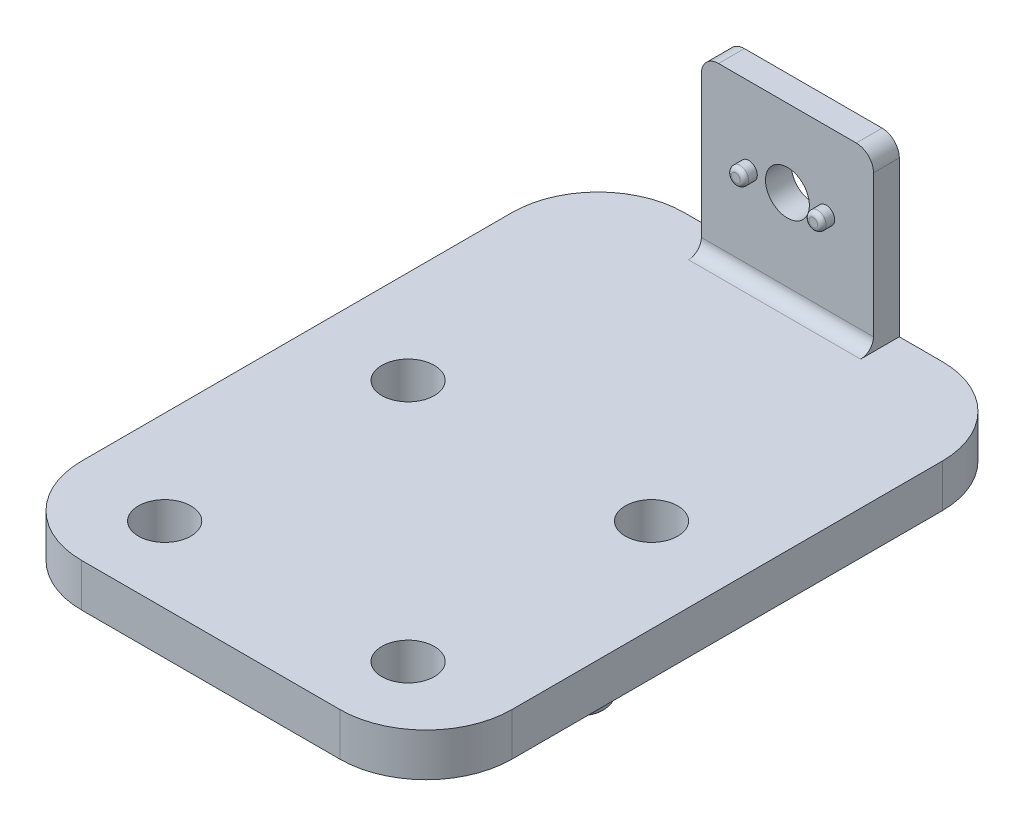
ISO-10303-21;
HEADER;
FILE_DESCRIPTION(('STEP AP214'),'2;1');
FILE_NAME('part.step','',(''),(''),'','','');
FILE_SCHEMA(('AUTOMOTIVE_DESIGN { 1 0 10303 214 1 1 1 1 }'));
ENDSEC;
DATA;
#1=APPLICATION_CONTEXT('core data for automotive mechanical design processes');
#2=APPLICATION_PROTOCOL_DEFINITION('international standard','automotive_design',2000,#1);
#3=PRODUCT_CONTEXT('',#1,'mechanical');
#4=PRODUCT('Part','Part','',(#3));
#5=PRODUCT_RELATED_PRODUCT_CATEGORY('part','',(#4));
#6=PRODUCT_DEFINITION_FORMATION('','',#4);
#7=PRODUCT_DEFINITION_CONTEXT('part definition',#1,'design');
#8=PRODUCT_DEFINITION('design','',#6,#7);
#9=PRODUCT_DEFINITION_SHAPE('','',#8);
#10=(LENGTH_UNIT() NAMED_UNIT(*) SI_UNIT(.MILLI.,.METRE.));
#11=(NAMED_UNIT(*) PLANE_ANGLE_UNIT() SI_UNIT($,.RADIAN.));
#12=(NAMED_UNIT(*) SI_UNIT($,.STERADIAN.) SOLID_ANGLE_UNIT());
#13=UNCERTAINTY_MEASURE_WITH_UNIT(LENGTH_MEASURE(1.E-05),#10,'distance_accuracy_value','');
#14=(GEOMETRIC_REPRESENTATION_CONTEXT(3) GLOBAL_UNCERTAINTY_ASSIGNED_CONTEXT((#13)) GLOBAL_UNIT_ASSIGNED_CONTEXT((#10,
#11,#12)) REPRESENTATION_CONTEXT('',''));
#15=CARTESIAN_POINT('',(0.,0.,0.));
#16=DIRECTION('',(0.,0.,1.));
#17=DIRECTION('',(1.,0.,0.));
#18=AXIS2_PLACEMENT_3D('',#15,#16,#17);
#19=CARTESIAN_POINT('',(-25.,5.,-47.0721884585665));
#20=DIRECTION('',(1.,0.,0.));
#21=DIRECTION('',(0.,0.,-1.));
#22=AXIS2_PLACEMENT_3D('',#19,#20,#21);
#23=PLANE('',#22);
#24=DIRECTION('',(0.,0.,1.));
#25=VECTOR('',#24,1.);
#26=CARTESIAN_POINT('',(-25.,5.,-47.0721884585665));
#27=LINE('',#26,#25);
#28=CARTESIAN_POINT('',(-25.,5.,-37.0721884585665));
#29=VERTEX_POINT('',#28);
#30=CARTESIAN_POINT('',(-25.,5.,12.9278115414336));
#31=VERTEX_POINT('',#30);
#32=EDGE_CURVE('E221',#29,#31,#27,.T.);
#33=ORIENTED_EDGE('',*,*,#32,.F.);
#34=DIRECTION('',(0.,-1.,0.));
#35=VECTOR('',#34,1.);
#36=CARTESIAN_POINT('',(-25.,5.,-37.0721884585665));
#37=LINE('',#36,#35);
#38=CARTESIAN_POINT('',(-25.,0.,-37.0721884585665));
#39=VERTEX_POINT('',#38);
#40=EDGE_CURVE('E265',#29,#39,#37,.T.);
#41=ORIENTED_EDGE('',*,*,#40,.T.);
#42=DIRECTION('',(0.,0.,1.));
#43=VECTOR('',#42,1.);
#44=CARTESIAN_POINT('',(-25.,0.,-47.0721884585665));
#45=LINE('',#44,#43);
#46=CARTESIAN_POINT('',(-25.,0.,12.9278115414336));
#47=VERTEX_POINT('',#46);
#48=EDGE_CURVE('E218',#39,#47,#45,.T.);
#49=ORIENTED_EDGE('',*,*,#48,.T.);
#50=DIRECTION('',(0.,-1.,0.));
#51=VECTOR('',#50,1.);
#52=CARTESIAN_POINT('',(-25.,5.,12.9278115414336));
#53=LINE('',#52,#51);
#54=EDGE_CURVE('E263',#47,#31,#53,.F.);
#55=ORIENTED_EDGE('',*,*,#54,.T.);
#56=EDGE_LOOP('',(#33,#41,#49,#55));
#57=FACE_BOUND('',#56,.T.);
#58=ADVANCED_FACE('F44',(#57),#23,.F.);
#59=CARTESIAN_POINT('',(-25.,5.,22.9278115414335));
#60=DIRECTION('',(0.,0.,-1.));
#61=DIRECTION('',(-1.,0.,0.));
#62=AXIS2_PLACEMENT_3D('',#59,#60,#61);
#63=PLANE('',#62);
#64=DIRECTION('',(1.,0.,0.));
#65=VECTOR('',#64,1.);
#66=CARTESIAN_POINT('',(-25.,5.,22.9278115414335));
#67=LINE('',#66,#65);
#68=CARTESIAN_POINT('',(-15.,5.,22.9278115414335));
#69=VERTEX_POINT('',#68);
#70=CARTESIAN_POINT('',(15.,5.,22.9278115414336));
#71=VERTEX_POINT('',#70);
#72=EDGE_CURVE('E224',#69,#71,#67,.T.);
#73=ORIENTED_EDGE('',*,*,#72,.F.);
#74=DIRECTION('',(0.,-1.,0.));
#75=VECTOR('',#74,1.);
#76=CARTESIAN_POINT('',(-15.,5.,22.9278115414335));
#77=LINE('',#76,#75);
#78=CARTESIAN_POINT('',(-15.,0.,22.9278115414335));
#79=VERTEX_POINT('',#78);
#80=EDGE_CURVE('E297',#69,#79,#77,.T.);
#81=ORIENTED_EDGE('',*,*,#80,.T.);
#82=DIRECTION('',(1.,0.,0.));
#83=VECTOR('',#82,1.);
#84=CARTESIAN_POINT('',(-25.,0.,22.9278115414335));
#85=LINE('',#84,#83);
#86=CARTESIAN_POINT('',(15.,0.,22.9278115414336));
#87=VERTEX_POINT('',#86);
#88=EDGE_CURVE('E238',#79,#87,#85,.T.);
#89=ORIENTED_EDGE('',*,*,#88,.T.);
#90=DIRECTION('',(0.,-1.,0.));
#91=VECTOR('',#90,1.);
#92=CARTESIAN_POINT('',(15.,5.,22.9278115414336));
#93=LINE('',#92,#91);
#94=EDGE_CURVE('E295',#87,#71,#93,.F.);
#95=ORIENTED_EDGE('',*,*,#94,.T.);
#96=EDGE_LOOP('',(#73,#81,#89,#95));
#97=FACE_BOUND('',#96,.T.);
#98=ADVANCED_FACE('F341',(#97),#63,.F.);
#99=CARTESIAN_POINT('',(25.,5.,-47.0721884585665));
#100=DIRECTION('',(-1.,0.,0.));
#101=DIRECTION('',(0.,0.,1.));
#102=AXIS2_PLACEMENT_3D('',#99,#100,#101);
#103=PLANE('',#102);
#104=DIRECTION('',(0.,0.,-1.));
#105=VECTOR('',#104,1.);
#106=CARTESIAN_POINT('',(25.,0.,-47.0721884585665));
#107=LINE('',#106,#105);
#108=CARTESIAN_POINT('',(25.,0.,12.9278115414335));
#109=VERTEX_POINT('',#108);
#110=CARTESIAN_POINT('',(25.,0.,-37.0721884585665));
#111=VERTEX_POINT('',#110);
#112=EDGE_CURVE('E241',#109,#111,#107,.T.);
#113=ORIENTED_EDGE('',*,*,#112,.T.);
#114=DIRECTION('',(0.,-1.,0.));
#115=VECTOR('',#114,1.);
#116=CARTESIAN_POINT('',(25.,5.,-37.0721884585665));
#117=LINE('',#116,#115);
#118=CARTESIAN_POINT('',(25.,5.,-37.0721884585665));
#119=VERTEX_POINT('',#118);
#120=EDGE_CURVE('E293',#111,#119,#117,.F.);
#121=ORIENTED_EDGE('',*,*,#120,.T.);
#122=DIRECTION('',(0.,0.,-1.));
#123=VECTOR('',#122,1.);
#124=CARTESIAN_POINT('',(25.,5.,-47.0721884585665));
#125=LINE('',#124,#123);
#126=CARTESIAN_POINT('',(25.,5.,12.9278115414335));
#127=VERTEX_POINT('',#126);
#128=EDGE_CURVE('E228',#127,#119,#125,.T.);
#129=ORIENTED_EDGE('',*,*,#128,.F.);
#130=DIRECTION('',(0.,-1.,0.));
#131=VECTOR('',#130,1.);
#132=CARTESIAN_POINT('',(25.,5.,12.9278115414335));
#133=LINE('',#132,#131);
#134=EDGE_CURVE('E290',#127,#109,#133,.T.);
#135=ORIENTED_EDGE('',*,*,#134,.T.);
#136=EDGE_LOOP('',(#113,#121,#129,#135));
#137=FACE_BOUND('',#136,.T.);
#138=ADVANCED_FACE('F347',(#137),#103,.F.);
#139=CARTESIAN_POINT('',(-25.,5.,-47.0721884585665));
#140=DIRECTION('',(0.,0.,1.));
#141=DIRECTION('',(1.,0.,0.));
#142=AXIS2_PLACEMENT_3D('',#139,#140,#141);
#143=PLANE('',#142);
#144=CARTESIAN_POINT('',(0.,16.,-47.0721884585665));
#145=DIRECTION('',(0.,0.,1.));
#146=DIRECTION('',(1.,0.,0.));
#147=AXIS2_PLACEMENT_3D('',#144,#145,#146);
#148=CIRCLE('',#147,2.55);
#149=CARTESIAN_POINT('',(2.55,16.,-47.0721884585665));
#150=VERTEX_POINT('',#149);
#151=EDGE_CURVE('E399',#150,#150,#148,.T.);
#152=ORIENTED_EDGE('',*,*,#151,.T.);
#153=EDGE_LOOP('',(#152));
#154=FACE_BOUND('',#153,.T.);
#155=DIRECTION('',(0.,-1.,0.));
#156=VECTOR('',#155,1.);
#157=CARTESIAN_POINT('',(-10.,25.,-47.0721884585665));
#158=LINE('',#157,#156);
#159=CARTESIAN_POINT('',(-10.,23.,-47.0721884585665));
#160=VERTEX_POINT('',#159);
#161=CARTESIAN_POINT('',(-10.,5.,-47.0721884585665));
#162=VERTEX_POINT('',#161);
#163=EDGE_CURVE('E190',#160,#162,#158,.T.);
#164=ORIENTED_EDGE('',*,*,#163,.F.);
#165=CARTESIAN_POINT('',(-8.,23.,-47.0721884585665));
#166=DIRECTION('',(0.,0.,1.));
#167=DIRECTION('',(1.,0.,0.));
#168=AXIS2_PLACEMENT_3D('',#165,#166,#167);
#169=CIRCLE('',#168,2.);
#170=CARTESIAN_POINT('',(-8.,25.,-47.0721884585665));
#171=VERTEX_POINT('',#170);
#172=EDGE_CURVE('E312',#160,#171,#169,.F.);
#173=ORIENTED_EDGE('',*,*,#172,.T.);
#174=DIRECTION('',(-1.,0.,0.));
#175=VECTOR('',#174,1.);
#176=CARTESIAN_POINT('',(-10.,25.,-47.0721884585665));
#177=LINE('',#176,#175);
#178=CARTESIAN_POINT('',(8.,25.,-47.0721884585665));
#179=VERTEX_POINT('',#178);
#180=EDGE_CURVE('E186',#179,#171,#177,.T.);
#181=ORIENTED_EDGE('',*,*,#180,.F.);
#182=CARTESIAN_POINT('',(8.,23.,-47.0721884585665));
#183=DIRECTION('',(0.,0.,1.));
#184=DIRECTION('',(1.,0.,0.));
#185=AXIS2_PLACEMENT_3D('',#182,#183,#184);
#186=CIRCLE('',#185,2.);
#187=CARTESIAN_POINT('',(10.,23.,-47.0721884585665));
#188=VERTEX_POINT('',#187);
#189=EDGE_CURVE('E59',#179,#188,#186,.F.);
#190=ORIENTED_EDGE('',*,*,#189,.T.);
#191=DIRECTION('',(0.,-1.,0.));
#192=VECTOR('',#191,1.);
#193=CARTESIAN_POINT('',(10.,25.,-47.0721884585665));
#194=LINE('',#193,#192);
#195=CARTESIAN_POINT('',(10.,5.,-47.0721884585665));
#196=VERTEX_POINT('',#195);
#197=EDGE_CURVE('E163',#188,#196,#194,.T.);
#198=ORIENTED_EDGE('',*,*,#197,.T.);
#199=DIRECTION('',(-1.,0.,0.));
#200=VECTOR('',#199,1.);
#201=CARTESIAN_POINT('',(-25.,5.,-47.0721884585665));
#202=LINE('',#201,#200);
#203=CARTESIAN_POINT('',(15.,5.,-47.0721884585665));
#204=VERTEX_POINT('',#203);
#205=EDGE_CURVE('E232',#204,#196,#202,.T.);
#206=ORIENTED_EDGE('',*,*,#205,.F.);
#207=DIRECTION('',(0.,-1.,0.));
#208=VECTOR('',#207,1.);
#209=CARTESIAN_POINT('',(15.,5.,-47.0721884585665));
#210=LINE('',#209,#208);
#211=CARTESIAN_POINT('',(15.,0.,-47.0721884585665));
#212=VERTEX_POINT('',#211);
#213=EDGE_CURVE('E276',#204,#212,#210,.T.);
#214=ORIENTED_EDGE('',*,*,#213,.T.);
#215=DIRECTION('',(-1.,0.,0.));
#216=VECTOR('',#215,1.);
#217=CARTESIAN_POINT('',(-25.,0.,-47.0721884585665));
#218=LINE('',#217,#216);
#219=CARTESIAN_POINT('',(-15.,0.,-47.0721884585665));
#220=VERTEX_POINT('',#219);
#221=EDGE_CURVE('E225',#212,#220,#218,.T.);
#222=ORIENTED_EDGE('',*,*,#221,.T.);
#223=DIRECTION('',(0.,-1.,0.));
#224=VECTOR('',#223,1.);
#225=CARTESIAN_POINT('',(-15.,5.,-47.0721884585665));
#226=LINE('',#225,#224);
#227=CARTESIAN_POINT('',(-15.,5.,-47.0721884585665));
#228=VERTEX_POINT('',#227);
#229=EDGE_CURVE('E279',#220,#228,#226,.F.);
#230=ORIENTED_EDGE('',*,*,#229,.T.);
#231=EDGE_CURVE('E231',#162,#228,#202,.T.);
#232=ORIENTED_EDGE('',*,*,#231,.F.);
#233=EDGE_LOOP('',(#164,#173,#181,#190,#198,#206,#214,#222,#230,#232));
#234=FACE_BOUND('',#233,.T.);
#235=ADVANCED_FACE('F456',(#154,#234),#143,.F.);
#236=CARTESIAN_POINT('',(0.,5.,0.));
#237=DIRECTION('',(0.,1.,0.));
#238=DIRECTION('',(0.,0.,1.));
#239=AXIS2_PLACEMENT_3D('',#236,#237,#238);
#240=PLANE('',#239);
#241=DIRECTION('',(0.,0.,-1.));
#242=VECTOR('',#241,1.);
#243=CARTESIAN_POINT('',(10.,5.,-47.0721884585665));
#244=LINE('',#243,#242);
#245=CARTESIAN_POINT('',(10.,5.,-42.5721884585665));
#246=VERTEX_POINT('',#245);
#247=EDGE_CURVE('E187',#246,#196,#244,.T.);
#248=ORIENTED_EDGE('',*,*,#247,.F.);
#249=DIRECTION('',(-1.,0.,0.));
#250=VECTOR('',#249,1.);
#251=CARTESIAN_POINT('',(10.,5.,-42.5721884585665));
#252=LINE('',#251,#250);
#253=CARTESIAN_POINT('',(-9.99999999999999,5.,-42.5721884585664));
#254=VERTEX_POINT('',#253);
#255=EDGE_CURVE('E173',#246,#254,#252,.T.);
#256=ORIENTED_EDGE('',*,*,#255,.T.);
#257=DIRECTION('',(0.,0.,1.));
#258=VECTOR('',#257,1.);
#259=CARTESIAN_POINT('',(-10.,5.,-47.0721884585665));
#260=LINE('',#259,#258);
#261=EDGE_CURVE('E179',#162,#254,#260,.T.);
#262=ORIENTED_EDGE('',*,*,#261,.F.);
#263=ORIENTED_EDGE('',*,*,#231,.T.);
#264=CARTESIAN_POINT('',(-15.,5.,-37.0721884585665));
#265=DIRECTION('',(0.,1.,0.));
#266=DIRECTION('',(0.,0.,1.));
#267=AXIS2_PLACEMENT_3D('',#264,#265,#266);
#268=CIRCLE('',#267,10.);
#269=EDGE_CURVE('E288',#228,#29,#268,.T.);
#270=ORIENTED_EDGE('',*,*,#269,.T.);
#271=ORIENTED_EDGE('',*,*,#32,.T.);
#272=CARTESIAN_POINT('',(-15.,5.,12.9278115414336));
#273=DIRECTION('',(0.,1.,0.));
#274=DIRECTION('',(0.,0.,1.));
#275=AXIS2_PLACEMENT_3D('',#272,#273,#274);
#276=CIRCLE('',#275,10.);
#277=EDGE_CURVE('E284',#31,#69,#276,.T.);
#278=ORIENTED_EDGE('',*,*,#277,.T.);
#279=ORIENTED_EDGE('',*,*,#72,.T.);
#280=CARTESIAN_POINT('',(15.,5.,12.9278115414335));
#281=DIRECTION('',(0.,1.,0.));
#282=DIRECTION('',(0.,0.,1.));
#283=AXIS2_PLACEMENT_3D('',#280,#281,#282);
#284=CIRCLE('',#283,10.);
#285=EDGE_CURVE('E282',#71,#127,#284,.T.);
#286=ORIENTED_EDGE('',*,*,#285,.T.);
#287=ORIENTED_EDGE('',*,*,#128,.T.);
#288=CARTESIAN_POINT('',(15.,5.,-37.0721884585665));
#289=DIRECTION('',(0.,1.,0.));
#290=DIRECTION('',(0.,0.,1.));
#291=AXIS2_PLACEMENT_3D('',#288,#289,#290);
#292=CIRCLE('',#291,10.);
#293=EDGE_CURVE('E286',#119,#204,#292,.T.);
#294=ORIENTED_EDGE('',*,*,#293,.T.);
#295=ORIENTED_EDGE('',*,*,#205,.T.);
#296=EDGE_LOOP('',(#248,#256,#262,#263,#270,#271,#278,#279,#286,#287,#294,#295));
#297=FACE_BOUND('',#296,.T.);
#298=CARTESIAN_POINT('',(14.142135623731,5.,-14.1421356237309));
#299=DIRECTION('',(0.,1.,0.));
#300=DIRECTION('',(0.,0.,1.));
#301=AXIS2_PLACEMENT_3D('',#298,#299,#300);
#302=CIRCLE('',#301,3.05000000000001);
#303=CARTESIAN_POINT('',(14.142135623731,5.,-11.0921356237309));
#304=VERTEX_POINT('',#303);
#305=EDGE_CURVE('E203',#304,#304,#302,.T.);
#306=ORIENTED_EDGE('',*,*,#305,.F.);
#307=EDGE_LOOP('',(#306));
#308=FACE_BOUND('',#307,.T.);
#309=CARTESIAN_POINT('',(-14.1421356237306,5.,14.1421356237313));
#310=DIRECTION('',(0.,1.,0.));
#311=DIRECTION('',(0.,0.,1.));
#312=AXIS2_PLACEMENT_3D('',#309,#310,#311);
#313=CIRCLE('',#312,3.05000000000034);
#314=CARTESIAN_POINT('',(-14.1421356237306,5.,17.1921356237316));
#315=VERTEX_POINT('',#314);
#316=EDGE_CURVE('E210',#315,#315,#313,.T.);
#317=ORIENTED_EDGE('',*,*,#316,.F.);
#318=EDGE_LOOP('',(#317));
#319=FACE_BOUND('',#318,.T.);
#320=CARTESIAN_POINT('',(14.1421356237313,5.,14.142135623731));
#321=DIRECTION('',(0.,1.,0.));
#322=DIRECTION('',(0.,0.,1.));
#323=AXIS2_PLACEMENT_3D('',#320,#321,#322);
#324=CIRCLE('',#323,3.04999999999992);
#325=CARTESIAN_POINT('',(14.1421356237313,5.,17.1921356237309));
#326=VERTEX_POINT('',#325);
#327=EDGE_CURVE('E197',#326,#326,#324,.T.);
#328=ORIENTED_EDGE('',*,*,#327,.F.);
#329=EDGE_LOOP('',(#328));
#330=FACE_BOUND('',#329,.T.);
#331=CARTESIAN_POINT('',(-14.1421356237309,5.,-14.1421356237306));
#332=DIRECTION('',(0.,1.,0.));
#333=DIRECTION('',(0.,0.,1.));
#334=AXIS2_PLACEMENT_3D('',#331,#332,#333);
#335=CIRCLE('',#334,3.05000000000049);
#336=CARTESIAN_POINT('',(-14.1421356237309,5.,-11.0921356237301));
#337=VERTEX_POINT('',#336);
#338=EDGE_CURVE('E206',#337,#337,#335,.T.);
#339=ORIENTED_EDGE('',*,*,#338,.F.);
#340=EDGE_LOOP('',(#339));
#341=FACE_BOUND('',#340,.T.);
#342=ADVANCED_FACE('F453',(#297,#308,#319,#330,#341),#240,.T.);
#343=CARTESIAN_POINT('',(0.,0.,0.));
#344=DIRECTION('',(0.,1.,0.));
#345=DIRECTION('',(0.,0.,1.));
#346=AXIS2_PLACEMENT_3D('',#343,#344,#345);
#347=PLANE('',#346);
#348=CARTESIAN_POINT('',(-20.,0.,-2.79318507107451E-13));
#349=DIRECTION('',(0.,1.,0.));
#350=DIRECTION('',(0.,0.,1.));
#351=AXIS2_PLACEMENT_3D('',#348,#349,#350);
#352=CIRCLE('',#351,2.95);
#353=CARTESIAN_POINT('',(-20.,0.,2.94999999999972));
#354=VERTEX_POINT('',#353);
#355=EDGE_CURVE('E248',#354,#354,#352,.F.);
#356=ORIENTED_EDGE('',*,*,#355,.F.);
#357=EDGE_LOOP('',(#356));
#358=FACE_BOUND('',#357,.T.);
#359=CARTESIAN_POINT('',(20.,0.,0.));
#360=DIRECTION('',(0.,1.,0.));
#361=DIRECTION('',(0.,0.,1.));
#362=AXIS2_PLACEMENT_3D('',#359,#360,#361);
#363=CIRCLE('',#362,2.95);
#364=CARTESIAN_POINT('',(20.,0.,2.95));
#365=VERTEX_POINT('',#364);
#366=EDGE_CURVE('E235',#365,#365,#363,.F.);
#367=ORIENTED_EDGE('',*,*,#366,.F.);
#368=EDGE_LOOP('',(#367));
#369=FACE_BOUND('',#368,.T.);
#370=CARTESIAN_POINT('',(14.142135623731,0.,-14.1421356237309));
#371=DIRECTION('',(0.,1.,0.));
#372=DIRECTION('',(0.,0.,1.));
#373=AXIS2_PLACEMENT_3D('',#370,#371,#372);
#374=CIRCLE('',#373,3.05000000000001);
#375=CARTESIAN_POINT('',(14.142135623731,0.,-11.0921356237309));
#376=VERTEX_POINT('',#375);
#377=EDGE_CURVE('E207',#376,#376,#374,.T.);
#378=ORIENTED_EDGE('',*,*,#377,.T.);
#379=EDGE_LOOP('',(#378));
#380=FACE_BOUND('',#379,.T.);
#381=CARTESIAN_POINT('',(-14.1421356237306,0.,14.1421356237313));
#382=DIRECTION('',(0.,1.,0.));
#383=DIRECTION('',(0.,0.,1.));
#384=AXIS2_PLACEMENT_3D('',#381,#382,#383);
#385=CIRCLE('',#384,3.05000000000034);
#386=CARTESIAN_POINT('',(-14.1421356237306,0.,17.1921356237316));
#387=VERTEX_POINT('',#386);
#388=EDGE_CURVE('E200',#387,#387,#385,.T.);
#389=ORIENTED_EDGE('',*,*,#388,.T.);
#390=EDGE_LOOP('',(#389));
#391=FACE_BOUND('',#390,.T.);
#392=CARTESIAN_POINT('',(14.1421356237313,0.,14.142135623731));
#393=DIRECTION('',(0.,1.,0.));
#394=DIRECTION('',(0.,0.,1.));
#395=AXIS2_PLACEMENT_3D('',#392,#393,#394);
#396=CIRCLE('',#395,3.04999999999992);
#397=CARTESIAN_POINT('',(14.1421356237313,0.,17.1921356237309));
#398=VERTEX_POINT('',#397);
#399=EDGE_CURVE('E196',#398,#398,#396,.T.);
#400=ORIENTED_EDGE('',*,*,#399,.T.);
#401=EDGE_LOOP('',(#400));
#402=FACE_BOUND('',#401,.T.);
#403=CARTESIAN_POINT('',(-14.1421356237309,0.,-14.1421356237306));
#404=DIRECTION('',(0.,1.,0.));
#405=DIRECTION('',(0.,0.,1.));
#406=AXIS2_PLACEMENT_3D('',#403,#404,#405);
#407=CIRCLE('',#406,3.05000000000049);
#408=CARTESIAN_POINT('',(-14.1421356237309,0.,-11.0921356237301));
#409=VERTEX_POINT('',#408);
#410=EDGE_CURVE('E215',#409,#409,#407,.T.);
#411=ORIENTED_EDGE('',*,*,#410,.T.);
#412=EDGE_LOOP('',(#411));
#413=FACE_BOUND('',#412,.T.);
#414=ORIENTED_EDGE('',*,*,#48,.F.);
#415=CARTESIAN_POINT('',(-15.,0.,-37.0721884585665));
#416=DIRECTION('',(0.,1.,0.));
#417=DIRECTION('',(0.,0.,1.));
#418=AXIS2_PLACEMENT_3D('',#415,#416,#417);
#419=CIRCLE('',#418,10.);
#420=EDGE_CURVE('E274',#39,#220,#419,.F.);
#421=ORIENTED_EDGE('',*,*,#420,.T.);
#422=ORIENTED_EDGE('',*,*,#221,.F.);
#423=CARTESIAN_POINT('',(15.,0.,-37.0721884585665));
#424=DIRECTION('',(0.,1.,0.));
#425=DIRECTION('',(0.,0.,1.));
#426=AXIS2_PLACEMENT_3D('',#423,#424,#425);
#427=CIRCLE('',#426,10.);
#428=EDGE_CURVE('E272',#212,#111,#427,.F.);
#429=ORIENTED_EDGE('',*,*,#428,.T.);
#430=ORIENTED_EDGE('',*,*,#112,.F.);
#431=CARTESIAN_POINT('',(15.,0.,12.9278115414335));
#432=DIRECTION('',(0.,1.,0.));
#433=DIRECTION('',(0.,0.,1.));
#434=AXIS2_PLACEMENT_3D('',#431,#432,#433);
#435=CIRCLE('',#434,10.);
#436=EDGE_CURVE('E268',#109,#87,#435,.F.);
#437=ORIENTED_EDGE('',*,*,#436,.T.);
#438=ORIENTED_EDGE('',*,*,#88,.F.);
#439=CARTESIAN_POINT('',(-15.,0.,12.9278115414336));
#440=DIRECTION('',(0.,1.,0.));
#441=DIRECTION('',(0.,0.,1.));
#442=AXIS2_PLACEMENT_3D('',#439,#440,#441);
#443=CIRCLE('',#442,10.);
#444=EDGE_CURVE('E270',#79,#47,#443,.F.);
#445=ORIENTED_EDGE('',*,*,#444,.T.);
#446=EDGE_LOOP('',(#414,#421,#422,#429,#430,#437,#438,#445));
#447=FACE_BOUND('',#446,.T.);
#448=ADVANCED_FACE('F451',(#358,#369,#380,#391,#402,#413,#447),#347,.F.);
#449=CARTESIAN_POINT('',(-14.1421356237309,0.,-14.1421356237306));
#450=DIRECTION('',(0.,1.,0.));
#451=DIRECTION('',(0.,0.,1.));
#452=AXIS2_PLACEMENT_3D('',#449,#450,#451);
#453=CYLINDRICAL_SURFACE('',#452,3.05000000000049);
#454=ORIENTED_EDGE('',*,*,#410,.F.);
#455=EDGE_LOOP('',(#454));
#456=FACE_BOUND('',#455,.T.);
#457=ORIENTED_EDGE('',*,*,#338,.T.);
#458=EDGE_LOOP('',(#457));
#459=FACE_BOUND('',#458,.T.);
#460=ADVANCED_FACE('F441',(#456,#459),#453,.F.);
#461=CARTESIAN_POINT('',(14.1421356237313,0.,14.142135623731));
#462=DIRECTION('',(0.,1.,0.));
#463=DIRECTION('',(0.,0.,1.));
#464=AXIS2_PLACEMENT_3D('',#461,#462,#463);
#465=CYLINDRICAL_SURFACE('',#464,3.04999999999992);
#466=ORIENTED_EDGE('',*,*,#399,.F.);
#467=EDGE_LOOP('',(#466));
#468=FACE_BOUND('',#467,.T.);
#469=ORIENTED_EDGE('',*,*,#327,.T.);
#470=EDGE_LOOP('',(#469));
#471=FACE_BOUND('',#470,.T.);
#472=ADVANCED_FACE('F437',(#468,#471),#465,.F.);
#473=CARTESIAN_POINT('',(-14.1421356237306,0.,14.1421356237313));
#474=DIRECTION('',(0.,1.,0.));
#475=DIRECTION('',(0.,0.,1.));
#476=AXIS2_PLACEMENT_3D('',#473,#474,#475);
#477=CYLINDRICAL_SURFACE('',#476,3.05000000000034);
#478=ORIENTED_EDGE('',*,*,#388,.F.);
#479=EDGE_LOOP('',(#478));
#480=FACE_BOUND('',#479,.T.);
#481=ORIENTED_EDGE('',*,*,#316,.T.);
#482=EDGE_LOOP('',(#481));
#483=FACE_BOUND('',#482,.T.);
#484=ADVANCED_FACE('F440',(#480,#483),#477,.F.);
#485=CARTESIAN_POINT('',(14.142135623731,0.,-14.1421356237309));
#486=DIRECTION('',(0.,1.,0.));
#487=DIRECTION('',(0.,0.,1.));
#488=AXIS2_PLACEMENT_3D('',#485,#486,#487);
#489=CYLINDRICAL_SURFACE('',#488,3.05000000000001);
#490=ORIENTED_EDGE('',*,*,#377,.F.);
#491=EDGE_LOOP('',(#490));
#492=FACE_BOUND('',#491,.T.);
#493=ORIENTED_EDGE('',*,*,#305,.T.);
#494=EDGE_LOOP('',(#493));
#495=FACE_BOUND('',#494,.T.);
#496=ADVANCED_FACE('F435',(#492,#495),#489,.F.);
#497=CARTESIAN_POINT('',(20.,-3.,0.));
#498=DIRECTION('',(0.,1.,0.));
#499=DIRECTION('',(0.,0.,1.));
#500=AXIS2_PLACEMENT_3D('',#497,#498,#499);
#501=CYLINDRICAL_SURFACE('',#500,2.95);
#502=CARTESIAN_POINT('',(20.,-2.,0.));
#503=DIRECTION('',(0.,-1.,0.));
#504=DIRECTION('',(0.,0.,-1.));
#505=AXIS2_PLACEMENT_3D('',#502,#503,#504);
#506=CIRCLE('',#505,2.95);
#507=CARTESIAN_POINT('',(20.,-2.,-2.95));
#508=VERTEX_POINT('',#507);
#509=EDGE_CURVE('E260',#508,#508,#506,.F.);
#510=ORIENTED_EDGE('',*,*,#509,.T.);
#511=EDGE_LOOP('',(#510));
#512=FACE_BOUND('',#511,.T.);
#513=ORIENTED_EDGE('',*,*,#366,.T.);
#514=EDGE_LOOP('',(#513));
#515=FACE_BOUND('',#514,.T.);
#516=ADVANCED_FACE('F431',(#512,#515),#501,.T.);
#517=CARTESIAN_POINT('',(20.,-3.,0.));
#518=DIRECTION('',(0.,-1.,0.));
#519=DIRECTION('',(0.,0.,-1.));
#520=AXIS2_PLACEMENT_3D('',#517,#518,#519);
#521=PLANE('',#520);
#522=CARTESIAN_POINT('',(20.,-3.,0.));
#523=DIRECTION('',(0.,-1.,0.));
#524=DIRECTION('',(0.,0.,-1.));
#525=AXIS2_PLACEMENT_3D('',#522,#523,#524);
#526=CIRCLE('',#525,1.95);
#527=CARTESIAN_POINT('',(20.,-3.,-1.95));
#528=VERTEX_POINT('',#527);
#529=EDGE_CURVE('E257',#528,#528,#526,.T.);
#530=ORIENTED_EDGE('',*,*,#529,.T.);
#531=EDGE_LOOP('',(#530));
#532=FACE_BOUND('',#531,.T.);
#533=ADVANCED_FACE('F424',(#532),#521,.T.);
#534=CARTESIAN_POINT('',(-20.,-3.,-2.79318507107451E-13));
#535=DIRECTION('',(0.,1.,0.));
#536=DIRECTION('',(0.,0.,1.));
#537=AXIS2_PLACEMENT_3D('',#534,#535,#536);
#538=CYLINDRICAL_SURFACE('',#537,2.95);
#539=CARTESIAN_POINT('',(-20.,-2.,-2.79318507107451E-13));
#540=DIRECTION('',(0.,-1.,0.));
#541=DIRECTION('',(0.,0.,-1.));
#542=AXIS2_PLACEMENT_3D('',#539,#540,#541);
#543=CIRCLE('',#542,2.95);
#544=CARTESIAN_POINT('',(-20.,-2.,-2.95000000000028));
#545=VERTEX_POINT('',#544);
#546=EDGE_CURVE('E254',#545,#545,#543,.F.);
#547=ORIENTED_EDGE('',*,*,#546,.T.);
#548=EDGE_LOOP('',(#547));
#549=FACE_BOUND('',#548,.T.);
#550=ORIENTED_EDGE('',*,*,#355,.T.);
#551=EDGE_LOOP('',(#550));
#552=FACE_BOUND('',#551,.T.);
#553=ADVANCED_FACE('F421',(#549,#552),#538,.T.);
#554=CARTESIAN_POINT('',(-20.,-3.,-2.79318507107451E-13));
#555=DIRECTION('',(0.,-1.,0.));
#556=DIRECTION('',(0.,0.,-1.));
#557=AXIS2_PLACEMENT_3D('',#554,#555,#556);
#558=PLANE('',#557);
#559=CARTESIAN_POINT('',(-20.,-3.,-2.79318507107451E-13));
#560=DIRECTION('',(0.,-1.,0.));
#561=DIRECTION('',(0.,0.,-1.));
#562=AXIS2_PLACEMENT_3D('',#559,#560,#561);
#563=CIRCLE('',#562,1.95);
#564=CARTESIAN_POINT('',(-20.,-3.,-1.95000000000028));
#565=VERTEX_POINT('',#564);
#566=EDGE_CURVE('E251',#565,#565,#563,.T.);
#567=ORIENTED_EDGE('',*,*,#566,.T.);
#568=EDGE_LOOP('',(#567));
#569=FACE_BOUND('',#568,.T.);
#570=ADVANCED_FACE('F357',(#569),#558,.T.);
#571=CARTESIAN_POINT('',(-20.,-2.,-2.79318507107451E-13));
#572=DIRECTION('',(0.,-1.,0.));
#573=DIRECTION('',(0.,0.,-1.));
#574=AXIS2_PLACEMENT_3D('',#571,#572,#573);
#575=TOROIDAL_SURFACE('',#574,1.95,1.);
#576=ORIENTED_EDGE('',*,*,#546,.F.);
#577=EDGE_LOOP('',(#576));
#578=FACE_BOUND('',#577,.T.);
#579=ORIENTED_EDGE('',*,*,#566,.F.);
#580=EDGE_LOOP('',(#579));
#581=FACE_BOUND('',#580,.T.);
#582=ADVANCED_FACE('F353',(#578,#581),#575,.T.);
#583=CARTESIAN_POINT('',(20.,-2.,0.));
#584=DIRECTION('',(0.,-1.,0.));
#585=DIRECTION('',(0.,0.,-1.));
#586=AXIS2_PLACEMENT_3D('',#583,#584,#585);
#587=TOROIDAL_SURFACE('',#586,1.95,1.);
#588=ORIENTED_EDGE('',*,*,#509,.F.);
#589=EDGE_LOOP('',(#588));
#590=FACE_BOUND('',#589,.T.);
#591=ORIENTED_EDGE('',*,*,#529,.F.);
#592=EDGE_LOOP('',(#591));
#593=FACE_BOUND('',#592,.T.);
#594=ADVANCED_FACE('F356',(#590,#593),#587,.T.);
#595=CARTESIAN_POINT('',(-15.,5.,-37.0721884585665));
#596=DIRECTION('',(0.,-1.,0.));
#597=DIRECTION('',(0.,0.,-1.));
#598=AXIS2_PLACEMENT_3D('',#595,#596,#597);
#599=CYLINDRICAL_SURFACE('',#598,10.);
#600=ORIENTED_EDGE('',*,*,#269,.F.);
#601=ORIENTED_EDGE('',*,*,#229,.F.);
#602=ORIENTED_EDGE('',*,*,#420,.F.);
#603=ORIENTED_EDGE('',*,*,#40,.F.);
#604=EDGE_LOOP('',(#600,#601,#602,#603));
#605=FACE_BOUND('',#604,.T.);
#606=ADVANCED_FACE('F361',(#605),#599,.T.);
#607=CARTESIAN_POINT('',(15.,5.,-37.0721884585665));
#608=DIRECTION('',(0.,-1.,0.));
#609=DIRECTION('',(0.,0.,-1.));
#610=AXIS2_PLACEMENT_3D('',#607,#608,#609);
#611=CYLINDRICAL_SURFACE('',#610,10.);
#612=ORIENTED_EDGE('',*,*,#293,.F.);
#613=ORIENTED_EDGE('',*,*,#120,.F.);
#614=ORIENTED_EDGE('',*,*,#428,.F.);
#615=ORIENTED_EDGE('',*,*,#213,.F.);
#616=EDGE_LOOP('',(#612,#613,#614,#615));
#617=FACE_BOUND('',#616,.T.);
#618=ADVANCED_FACE('F365',(#617),#611,.T.);
#619=CARTESIAN_POINT('',(-15.,5.,12.9278115414336));
#620=DIRECTION('',(0.,-1.,0.));
#621=DIRECTION('',(0.,0.,-1.));
#622=AXIS2_PLACEMENT_3D('',#619,#620,#621);
#623=CYLINDRICAL_SURFACE('',#622,10.);
#624=ORIENTED_EDGE('',*,*,#277,.F.);
#625=ORIENTED_EDGE('',*,*,#54,.F.);
#626=ORIENTED_EDGE('',*,*,#444,.F.);
#627=ORIENTED_EDGE('',*,*,#80,.F.);
#628=EDGE_LOOP('',(#624,#625,#626,#627));
#629=FACE_BOUND('',#628,.T.);
#630=ADVANCED_FACE('F369',(#629),#623,.T.);
#631=CARTESIAN_POINT('',(15.,5.,12.9278115414335));
#632=DIRECTION('',(0.,-1.,0.));
#633=DIRECTION('',(0.,0.,-1.));
#634=AXIS2_PLACEMENT_3D('',#631,#632,#633);
#635=CYLINDRICAL_SURFACE('',#634,10.);
#636=ORIENTED_EDGE('',*,*,#285,.F.);
#637=ORIENTED_EDGE('',*,*,#94,.F.);
#638=ORIENTED_EDGE('',*,*,#436,.F.);
#639=ORIENTED_EDGE('',*,*,#134,.F.);
#640=EDGE_LOOP('',(#636,#637,#638,#639));
#641=FACE_BOUND('',#640,.T.);
#642=ADVANCED_FACE('F373',(#641),#635,.T.);
#643=CARTESIAN_POINT('',(-10.,25.,-47.0721884585665));
#644=DIRECTION('',(1.,0.,0.));
#645=DIRECTION('',(0.,0.,-1.));
#646=AXIS2_PLACEMENT_3D('',#643,#644,#645);
#647=PLANE('',#646);
#648=DIRECTION('',(0.,-1.,0.));
#649=VECTOR('',#648,1.);
#650=CARTESIAN_POINT('',(-10.,25.,-44.0721884585665));
#651=LINE('',#650,#649);
#652=CARTESIAN_POINT('',(-10.,23.,-44.0721884585665));
#653=VERTEX_POINT('',#652);
#654=CARTESIAN_POINT('',(-9.99999999999999,6.5,-44.0721884585664));
#655=VERTEX_POINT('',#654);
#656=EDGE_CURVE('E162',#653,#655,#651,.T.);
#657=ORIENTED_EDGE('',*,*,#656,.F.);
#658=DIRECTION('',(0.,0.,1.));
#659=VECTOR('',#658,1.);
#660=CARTESIAN_POINT('',(-10.,23.,-47.0721884585665));
#661=LINE('',#660,#659);
#662=EDGE_CURVE('E67',#653,#160,#661,.F.);
#663=ORIENTED_EDGE('',*,*,#662,.T.);
#664=ORIENTED_EDGE('',*,*,#163,.T.);
#665=ORIENTED_EDGE('',*,*,#261,.T.);
#666=CARTESIAN_POINT('',(-9.99999999999999,6.5,-42.5721884585664));
#667=DIRECTION('',(1.,0.,0.));
#668=DIRECTION('',(0.,0.,-1.));
#669=AXIS2_PLACEMENT_3D('',#666,#667,#668);
#670=CIRCLE('',#669,1.5);
#671=EDGE_CURVE('E174',#254,#655,#670,.T.);
#672=ORIENTED_EDGE('',*,*,#671,.T.);
#673=EDGE_LOOP('',(#657,#663,#664,#665,#672));
#674=FACE_BOUND('',#673,.T.);
#675=ADVANCED_FACE('F377',(#674),#647,.F.);
#676=CARTESIAN_POINT('',(-10.,25.,-44.0721884585665));
#677=DIRECTION('',(0.,0.,-1.));
#678=DIRECTION('',(-1.,0.,0.));
#679=AXIS2_PLACEMENT_3D('',#676,#677,#678);
#680=PLANE('',#679);
#681=CARTESIAN_POINT('',(4.5,16.,-44.0721884585665));
#682=DIRECTION('',(0.,0.,-1.));
#683=DIRECTION('',(-1.,0.,0.));
#684=AXIS2_PLACEMENT_3D('',#681,#682,#683);
#685=CIRCLE('',#684,1.);
#686=CARTESIAN_POINT('',(3.5,16.,-44.0721884585665));
#687=VERTEX_POINT('',#686);
#688=EDGE_CURVE('E318',#687,#687,#685,.F.);
#689=ORIENTED_EDGE('',*,*,#688,.F.);
#690=EDGE_LOOP('',(#689));
#691=FACE_BOUND('',#690,.T.);
#692=CARTESIAN_POINT('',(-4.5,16.,-44.0721884585665));
#693=DIRECTION('',(0.,0.,-1.));
#694=DIRECTION('',(-1.,0.,0.));
#695=AXIS2_PLACEMENT_3D('',#692,#693,#694);
#696=CIRCLE('',#695,1.);
#697=CARTESIAN_POINT('',(-5.5,16.,-44.0721884585665));
#698=VERTEX_POINT('',#697);
#699=EDGE_CURVE('E315',#698,#698,#696,.F.);
#700=ORIENTED_EDGE('',*,*,#699,.F.);
#701=EDGE_LOOP('',(#700));
#702=FACE_BOUND('',#701,.T.);
#703=CARTESIAN_POINT('',(0.,16.,-44.0721884585665));
#704=DIRECTION('',(0.,0.,1.));
#705=DIRECTION('',(1.,0.,0.));
#706=AXIS2_PLACEMENT_3D('',#703,#704,#705);
#707=CIRCLE('',#706,2.55);
#708=CARTESIAN_POINT('',(2.55,16.,-44.0721884585665));
#709=VERTEX_POINT('',#708);
#710=EDGE_CURVE('E401',#709,#709,#707,.T.);
#711=ORIENTED_EDGE('',*,*,#710,.F.);
#712=EDGE_LOOP('',(#711));
#713=FACE_BOUND('',#712,.T.);
#714=DIRECTION('',(1.,0.,0.));
#715=VECTOR('',#714,1.);
#716=CARTESIAN_POINT('',(-10.,25.,-44.0721884585665));
#717=LINE('',#716,#715);
#718=CARTESIAN_POINT('',(-8.,25.,-44.0721884585665));
#719=VERTEX_POINT('',#718);
#720=CARTESIAN_POINT('',(8.,25.,-44.0721884585665));
#721=VERTEX_POINT('',#720);
#722=EDGE_CURVE('E183',#719,#721,#717,.T.);
#723=ORIENTED_EDGE('',*,*,#722,.F.);
#724=CARTESIAN_POINT('',(-8.,23.,-44.0721884585665));
#725=DIRECTION('',(0.,0.,-1.));
#726=DIRECTION('',(-1.,0.,0.));
#727=AXIS2_PLACEMENT_3D('',#724,#725,#726);
#728=CIRCLE('',#727,2.);
#729=EDGE_CURVE('E308',#719,#653,#728,.F.);
#730=ORIENTED_EDGE('',*,*,#729,.T.);
#731=ORIENTED_EDGE('',*,*,#656,.T.);
#732=DIRECTION('',(-1.,0.,0.));
#733=VECTOR('',#732,1.);
#734=CARTESIAN_POINT('',(10.,6.5,-44.0721884585665));
#735=LINE('',#734,#733);
#736=CARTESIAN_POINT('',(10.,6.5,-44.0721884585665));
#737=VERTEX_POINT('',#736);
#738=EDGE_CURVE('E170',#737,#655,#735,.T.);
#739=ORIENTED_EDGE('',*,*,#738,.F.);
#740=DIRECTION('',(0.,-1.,0.));
#741=VECTOR('',#740,1.);
#742=CARTESIAN_POINT('',(10.,25.,-44.0721884585665));
#743=LINE('',#742,#741);
#744=CARTESIAN_POINT('',(10.,23.,-44.0721884585665));
#745=VERTEX_POINT('',#744);
#746=EDGE_CURVE('E152',#745,#737,#743,.T.);
#747=ORIENTED_EDGE('',*,*,#746,.F.);
#748=CARTESIAN_POINT('',(8.,23.,-44.0721884585665));
#749=DIRECTION('',(0.,0.,-1.));
#750=DIRECTION('',(-1.,0.,0.));
#751=AXIS2_PLACEMENT_3D('',#748,#749,#750);
#752=CIRCLE('',#751,2.);
#753=EDGE_CURVE('E306',#745,#721,#752,.F.);
#754=ORIENTED_EDGE('',*,*,#753,.T.);
#755=EDGE_LOOP('',(#723,#730,#731,#739,#747,#754));
#756=FACE_BOUND('',#755,.T.);
#757=ADVANCED_FACE('F177',(#691,#702,#713,#756),#680,.F.);
#758=CARTESIAN_POINT('',(10.,25.,-47.0721884585665));
#759=DIRECTION('',(-1.,0.,0.));
#760=DIRECTION('',(0.,0.,1.));
#761=AXIS2_PLACEMENT_3D('',#758,#759,#760);
#762=PLANE('',#761);
#763=ORIENTED_EDGE('',*,*,#197,.F.);
#764=DIRECTION('',(0.,0.,-1.));
#765=VECTOR('',#764,1.);
#766=CARTESIAN_POINT('',(10.,23.,-44.0721884585665));
#767=LINE('',#766,#765);
#768=EDGE_CURVE('E158',#188,#745,#767,.F.);
#769=ORIENTED_EDGE('',*,*,#768,.T.);
#770=ORIENTED_EDGE('',*,*,#746,.T.);
#771=CARTESIAN_POINT('',(10.,6.5,-42.5721884585665));
#772=DIRECTION('',(1.,0.,0.));
#773=DIRECTION('',(0.,0.,-1.));
#774=AXIS2_PLACEMENT_3D('',#771,#772,#773);
#775=CIRCLE('',#774,1.5);
#776=EDGE_CURVE('E156',#246,#737,#775,.T.);
#777=ORIENTED_EDGE('',*,*,#776,.F.);
#778=ORIENTED_EDGE('',*,*,#247,.T.);
#779=EDGE_LOOP('',(#763,#769,#770,#777,#778));
#780=FACE_BOUND('',#779,.T.);
#781=ADVANCED_FACE('F154',(#780),#762,.F.);
#782=CARTESIAN_POINT('',(0.,25.,0.));
#783=DIRECTION('',(0.,1.,0.));
#784=DIRECTION('',(0.,0.,1.));
#785=AXIS2_PLACEMENT_3D('',#782,#783,#784);
#786=PLANE('',#785);
#787=ORIENTED_EDGE('',*,*,#180,.T.);
#788=DIRECTION('',(0.,0.,1.));
#789=VECTOR('',#788,1.);
#790=CARTESIAN_POINT('',(-8.,25.,-44.0721884585665));
#791=LINE('',#790,#789);
#792=EDGE_CURVE('E303',#171,#719,#791,.T.);
#793=ORIENTED_EDGE('',*,*,#792,.T.);
#794=ORIENTED_EDGE('',*,*,#722,.T.);
#795=DIRECTION('',(0.,0.,-1.));
#796=VECTOR('',#795,1.);
#797=CARTESIAN_POINT('',(8.,25.,-47.0721884585665));
#798=LINE('',#797,#796);
#799=EDGE_CURVE('E300',#721,#179,#798,.T.);
#800=ORIENTED_EDGE('',*,*,#799,.T.);
#801=EDGE_LOOP('',(#787,#793,#794,#800));
#802=FACE_BOUND('',#801,.T.);
#803=ADVANCED_FACE('F395',(#802),#786,.T.);
#804=CARTESIAN_POINT('',(10.,6.5,-42.5721884585665));
#805=DIRECTION('',(-1.,0.,0.));
#806=DIRECTION('',(0.,0.,1.));
#807=AXIS2_PLACEMENT_3D('',#804,#805,#806);
#808=CYLINDRICAL_SURFACE('',#807,1.5);
#809=ORIENTED_EDGE('',*,*,#671,.F.);
#810=ORIENTED_EDGE('',*,*,#255,.F.);
#811=ORIENTED_EDGE('',*,*,#776,.T.);
#812=ORIENTED_EDGE('',*,*,#738,.T.);
#813=EDGE_LOOP('',(#809,#810,#811,#812));
#814=FACE_BOUND('',#813,.T.);
#815=ADVANCED_FACE('F169',(#814),#808,.F.);
#816=CARTESIAN_POINT('',(-7.99999999999998,23.,0.));
#817=DIRECTION('',(0.,0.,-1.));
#818=DIRECTION('',(-1.,0.,0.));
#819=AXIS2_PLACEMENT_3D('',#816,#817,#818);
#820=CYLINDRICAL_SURFACE('',#819,2.);
#821=ORIENTED_EDGE('',*,*,#172,.F.);
#822=ORIENTED_EDGE('',*,*,#662,.F.);
#823=ORIENTED_EDGE('',*,*,#729,.F.);
#824=ORIENTED_EDGE('',*,*,#792,.F.);
#825=EDGE_LOOP('',(#821,#822,#823,#824));
#826=FACE_BOUND('',#825,.T.);
#827=ADVANCED_FACE('F379',(#826),#820,.T.);
#828=CARTESIAN_POINT('',(8.00000000000002,23.,0.));
#829=DIRECTION('',(0.,0.,1.));
#830=DIRECTION('',(1.,0.,0.));
#831=AXIS2_PLACEMENT_3D('',#828,#829,#830);
#832=CYLINDRICAL_SURFACE('',#831,2.);
#833=ORIENTED_EDGE('',*,*,#753,.F.);
#834=ORIENTED_EDGE('',*,*,#768,.F.);
#835=ORIENTED_EDGE('',*,*,#189,.F.);
#836=ORIENTED_EDGE('',*,*,#799,.F.);
#837=EDGE_LOOP('',(#833,#834,#835,#836));
#838=FACE_BOUND('',#837,.T.);
#839=ADVANCED_FACE('F382',(#838),#832,.T.);
#840=CARTESIAN_POINT('',(0.,16.,-47.0721884585665));
#841=DIRECTION('',(0.,0.,1.));
#842=DIRECTION('',(1.,0.,0.));
#843=AXIS2_PLACEMENT_3D('',#840,#841,#842);
#844=CYLINDRICAL_SURFACE('',#843,2.55);
#845=CARTESIAN_POINT('',(2.55,16.,-47.0721884585665));
#846=CARTESIAN_POINT('',(2.55,16.,-47.0409384585665));
#847=CARTESIAN_POINT('',(2.55,16.,-47.0096884585665));
#848=CARTESIAN_POINT('',(2.55,16.,-46.9471884585665));
#849=CARTESIAN_POINT('',(2.55,16.,-46.9159384585665));
#850=CARTESIAN_POINT('',(2.55,16.,-46.8534384585665));
#851=CARTESIAN_POINT('',(2.55,16.,-46.8221884585665));
#852=CARTESIAN_POINT('',(2.55,16.,-46.7596884585665));
#853=CARTESIAN_POINT('',(2.55,16.,-46.7284384585665));
#854=CARTESIAN_POINT('',(2.55,16.,-46.6659384585665));
#855=CARTESIAN_POINT('',(2.55,16.,-46.6346884585665));
#856=CARTESIAN_POINT('',(2.55,16.,-46.5721884585665));
#857=CARTESIAN_POINT('',(2.55,16.,-46.5409384585665));
#858=CARTESIAN_POINT('',(2.55,16.,-46.4784384585665));
#859=CARTESIAN_POINT('',(2.55,16.,-46.4471884585665));
#860=CARTESIAN_POINT('',(2.55,16.,-46.3846884585665));
#861=CARTESIAN_POINT('',(2.55,16.,-46.3534384585665));
#862=CARTESIAN_POINT('',(2.55,16.,-46.2909384585665));
#863=CARTESIAN_POINT('',(2.55,16.,-46.2596884585665));
#864=CARTESIAN_POINT('',(2.55,16.,-46.1971884585665));
#865=CARTESIAN_POINT('',(2.55,16.,-46.1659384585665));
#866=CARTESIAN_POINT('',(2.55,16.,-46.1034384585665));
#867=CARTESIAN_POINT('',(2.55,16.,-46.0721884585665));
#868=CARTESIAN_POINT('',(2.55,16.,-46.0096884585665));
#869=CARTESIAN_POINT('',(2.55,16.,-45.9784384585665));
#870=CARTESIAN_POINT('',(2.55,16.,-45.9159384585665));
#871=CARTESIAN_POINT('',(2.55,16.,-45.8846884585665));
#872=CARTESIAN_POINT('',(2.55,16.,-45.8221884585665));
#873=CARTESIAN_POINT('',(2.55,16.,-45.7909384585665));
#874=CARTESIAN_POINT('',(2.55,16.,-45.7284384585665));
#875=CARTESIAN_POINT('',(2.55,16.,-45.6971884585665));
#876=CARTESIAN_POINT('',(2.55,16.,-45.6346884585665));
#877=CARTESIAN_POINT('',(2.55,16.,-45.6034384585665));
#878=CARTESIAN_POINT('',(2.55,16.,-45.5409384585665));
#879=CARTESIAN_POINT('',(2.55,16.,-45.5096884585665));
#880=CARTESIAN_POINT('',(2.55,16.,-45.4471884585665));
#881=CARTESIAN_POINT('',(2.55,16.,-45.4159384585665));
#882=CARTESIAN_POINT('',(2.55,16.,-45.3534384585665));
#883=CARTESIAN_POINT('',(2.55,16.,-45.3221884585665));
#884=CARTESIAN_POINT('',(2.55,16.,-45.2596884585665));
#885=CARTESIAN_POINT('',(2.55,16.,-45.2284384585665));
#886=CARTESIAN_POINT('',(2.55,16.,-45.1659384585665));
#887=CARTESIAN_POINT('',(2.55,16.,-45.1346884585665));
#888=CARTESIAN_POINT('',(2.55,16.,-45.0721884585665));
#889=CARTESIAN_POINT('',(2.55,16.,-45.0409384585665));
#890=CARTESIAN_POINT('',(2.55,16.,-44.9784384585665));
#891=CARTESIAN_POINT('',(2.55,16.,-44.9471884585665));
#892=CARTESIAN_POINT('',(2.55,16.,-44.8846884585665));
#893=CARTESIAN_POINT('',(2.55,16.,-44.8534384585665));
#894=CARTESIAN_POINT('',(2.55,16.,-44.7909384585665));
#895=CARTESIAN_POINT('',(2.55,16.,-44.7596884585665));
#896=CARTESIAN_POINT('',(2.55,16.,-44.6971884585665));
#897=CARTESIAN_POINT('',(2.55,16.,-44.6659384585665));
#898=CARTESIAN_POINT('',(2.55,16.,-44.6034384585665));
#899=CARTESIAN_POINT('',(2.55,16.,-44.5721884585665));
#900=CARTESIAN_POINT('',(2.55,16.,-44.5096884585665));
#901=CARTESIAN_POINT('',(2.55,16.,-44.4784384585665));
#902=CARTESIAN_POINT('',(2.55,16.,-44.4159384585665));
#903=CARTESIAN_POINT('',(2.55,16.,-44.3846884585665));
#904=CARTESIAN_POINT('',(2.55,16.,-44.3221884585665));
#905=CARTESIAN_POINT('',(2.55,16.,-44.2909384585665));
#906=CARTESIAN_POINT('',(2.55,16.,-44.2284384585665));
#907=CARTESIAN_POINT('',(2.55,16.,-44.1971884585665));
#908=CARTESIAN_POINT('',(2.55,16.,-44.1346884585665));
#909=CARTESIAN_POINT('',(2.55,16.,-44.1034384585665));
#910=CARTESIAN_POINT('',(2.55,16.,-44.0721884585665));
#911=B_SPLINE_CURVE_WITH_KNOTS('',3,(#845,#846,#847,#848,#849,#850,#851,#852,#853,#854,#855,
#856,#857,#858,#859,#860,#861,#862,#863,#864,#865,#866,#867,#868,#869,#870,#871,#872,#873,#874,
#875,#876,#877,#878,#879,#880,#881,#882,#883,#884,#885,#886,#887,#888,#889,#890,#891,#892,#893,
#894,#895,#896,#897,#898,#899,#900,#901,#902,#903,#904,#905,#906,#907,#908,#909,#910),
.UNSPECIFIED.,.F.,.F.,(4,2,2,2,2,2,2,2,2,2,2,2,2,2,2,2,2,2,2,2,2,2,2,2,2,2,2,2,2,2,2,2,4),(0.,
0.0937499999999966,0.1875,0.281249999999997,0.375,0.468749999999997,0.5625,0.656250000000004,
0.750000000000001,0.843750000000004,0.937500000000001,1.03125,1.12500000000001,1.21875,
1.31250000000001,1.40625,1.50000000000001,1.59375000000001,1.68750000000001,1.78125000000001,
1.87500000000001,1.96875000000001,2.06250000000002,2.15625000000001,2.25000000000002,
2.34375000000001,2.43750000000002,2.53125000000002,2.62500000000002,2.71875000000002,
2.81250000000002,2.90625000000002,3.00000000000002),.UNSPECIFIED.);
#912=EDGE_CURVE('BSEAM385',#150,#709,#911,.T.);
#913=ORIENTED_EDGE('',*,*,#151,.F.);
#914=ORIENTED_EDGE('',*,*,#710,.T.);
#915=ORIENTED_EDGE('',*,*,#912,.T.);
#916=ORIENTED_EDGE('',*,*,#912,.F.);
#917=EDGE_LOOP('',(#913,#915,#914,#916));
#918=FACE_BOUND('',#917,.T.);
#919=ADVANCED_FACE('F385',(#918),#844,.F.);
#920=CARTESIAN_POINT('',(-4.5,16.,-42.5721884585665));
#921=DIRECTION('',(0.,0.,-1.));
#922=DIRECTION('',(-1.,0.,0.));
#923=AXIS2_PLACEMENT_3D('',#920,#921,#922);
#924=CYLINDRICAL_SURFACE('',#923,1.);
#925=CARTESIAN_POINT('',(-4.5,16.,-43.0721884585665));
#926=DIRECTION('',(0.,0.,1.));
#927=DIRECTION('',(1.,0.,0.));
#928=AXIS2_PLACEMENT_3D('',#925,#926,#927);
#929=CIRCLE('',#928,1.);
#930=CARTESIAN_POINT('',(-3.5,16.,-43.0721884585665));
#931=VERTEX_POINT('',#930);
#932=EDGE_CURVE('E11',#931,#931,#929,.F.);
#933=ORIENTED_EDGE('',*,*,#932,.T.);
#934=EDGE_LOOP('',(#933));
#935=FACE_BOUND('',#934,.T.);
#936=ORIENTED_EDGE('',*,*,#699,.T.);
#937=EDGE_LOOP('',(#936));
#938=FACE_BOUND('',#937,.T.);
#939=ADVANCED_FACE('F390',(#935,#938),#924,.T.);
#940=CARTESIAN_POINT('',(0.,0.,-42.5721884585665));
#941=DIRECTION('',(0.,0.,1.));
#942=DIRECTION('',(1.,0.,0.));
#943=AXIS2_PLACEMENT_3D('',#940,#941,#942);
#944=PLANE('',#943);
#945=CARTESIAN_POINT('',(-4.5,16.,-42.5721884585665));
#946=DIRECTION('',(0.,0.,1.));
#947=DIRECTION('',(1.,0.,0.));
#948=AXIS2_PLACEMENT_3D('',#945,#946,#947);
#949=CIRCLE('',#948,0.5);
#950=CARTESIAN_POINT('',(-4.,16.,-42.5721884585665));
#951=VERTEX_POINT('',#950);
#952=EDGE_CURVE('E52',#951,#951,#949,.T.);
#953=ORIENTED_EDGE('',*,*,#952,.T.);
#954=EDGE_LOOP('',(#953));
#955=FACE_BOUND('',#954,.T.);
#956=ADVANCED_FACE('F329',(#955),#944,.T.);
#957=CARTESIAN_POINT('',(4.5,16.,-42.5721884585665));
#958=DIRECTION('',(0.,0.,-1.));
#959=DIRECTION('',(-1.,0.,0.));
#960=AXIS2_PLACEMENT_3D('',#957,#958,#959);
#961=CYLINDRICAL_SURFACE('',#960,1.);
#962=CARTESIAN_POINT('',(4.5,16.,-43.0721884585665));
#963=DIRECTION('',(0.,0.,1.));
#964=DIRECTION('',(1.,0.,0.));
#965=AXIS2_PLACEMENT_3D('',#962,#963,#964);
#966=CIRCLE('',#965,1.);
#967=CARTESIAN_POINT('',(5.5,16.,-43.0721884585665));
#968=VERTEX_POINT('',#967);
#969=EDGE_CURVE('E324',#968,#968,#966,.F.);
#970=ORIENTED_EDGE('',*,*,#969,.T.);
#971=EDGE_LOOP('',(#970));
#972=FACE_BOUND('',#971,.T.);
#973=ORIENTED_EDGE('',*,*,#688,.T.);
#974=EDGE_LOOP('',(#973));
#975=FACE_BOUND('',#974,.T.);
#976=ADVANCED_FACE('F639',(#972,#975),#961,.T.);
#977=CARTESIAN_POINT('',(0.,0.,-42.5721884585665));
#978=DIRECTION('',(0.,0.,1.));
#979=DIRECTION('',(1.,0.,0.));
#980=AXIS2_PLACEMENT_3D('',#977,#978,#979);
#981=PLANE('',#980);
#982=CARTESIAN_POINT('',(4.5,16.,-42.5721884585665));
#983=DIRECTION('',(0.,0.,1.));
#984=DIRECTION('',(1.,0.,0.));
#985=AXIS2_PLACEMENT_3D('',#982,#983,#984);
#986=CIRCLE('',#985,0.500000000000001);
#987=CARTESIAN_POINT('',(5.,16.,-42.5721884585665));
#988=VERTEX_POINT('',#987);
#989=EDGE_CURVE('E321',#988,#988,#986,.T.);
#990=ORIENTED_EDGE('',*,*,#989,.T.);
#991=EDGE_LOOP('',(#990));
#992=FACE_BOUND('',#991,.T.);
#993=ADVANCED_FACE('F337',(#992),#981,.T.);
#994=CARTESIAN_POINT('',(4.5,16.,-43.0721884585665));
#995=DIRECTION('',(0.,0.,1.));
#996=DIRECTION('',(1.,0.,0.));
#997=AXIS2_PLACEMENT_3D('',#994,#995,#996);
#998=TOROIDAL_SURFACE('',#997,0.500000000000001,0.5);
#999=ORIENTED_EDGE('',*,*,#969,.F.);
#1000=EDGE_LOOP('',(#999));
#1001=FACE_BOUND('',#1000,.T.);
#1002=ORIENTED_EDGE('',*,*,#989,.F.);
#1003=EDGE_LOOP('',(#1002));
#1004=FACE_BOUND('',#1003,.T.);
#1005=ADVANCED_FACE('F332',(#1001,#1004),#998,.T.);
#1006=CARTESIAN_POINT('',(-4.5,16.,-43.0721884585665));
#1007=DIRECTION('',(0.,0.,1.));
#1008=DIRECTION('',(1.,0.,0.));
#1009=AXIS2_PLACEMENT_3D('',#1006,#1007,#1008);
#1010=TOROIDAL_SURFACE('',#1009,0.5,0.5);
#1011=ORIENTED_EDGE('',*,*,#932,.F.);
#1012=EDGE_LOOP('',(#1011));
#1013=FACE_BOUND('',#1012,.T.);
#1014=ORIENTED_EDGE('',*,*,#952,.F.);
#1015=EDGE_LOOP('',(#1014));
#1016=FACE_BOUND('',#1015,.T.);
#1017=ADVANCED_FACE('F46',(#1013,#1016),#1010,.T.);
#1018=CLOSED_SHELL('',(#58,#98,#138,#235,#342,#448,#460,#472,#484,#496,#516,#533,#553,#570,#582,
#594,#606,#618,#630,#642,#675,#757,#781,#803,#815,#827,#839,#919,#939,#956,#976,#993,#1005,#1017));
#1019=MANIFOLD_SOLID_BREP('B2',#1018);
#1020=ADVANCED_BREP_SHAPE_REPRESENTATION('',(#18,#1019),#14);
#1021=SHAPE_DEFINITION_REPRESENTATION(#9,#1020);
ENDSEC;
END-ISO-10303-21;
